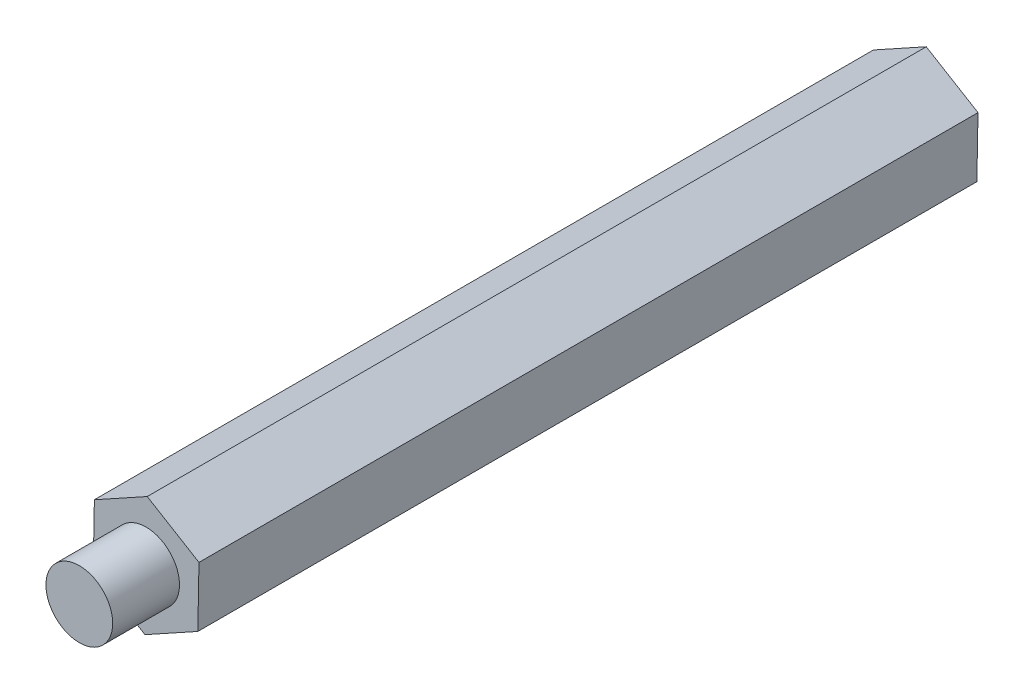
ISO-10303-21;
HEADER;
FILE_DESCRIPTION(('STEP AP214'),'2;1');
FILE_NAME('part.step','',(''),(''),'','','');
FILE_SCHEMA(('AUTOMOTIVE_DESIGN { 1 0 10303 214 1 1 1 1 }'));
ENDSEC;
DATA;
#1=APPLICATION_CONTEXT('core data for automotive mechanical design processes');
#2=APPLICATION_PROTOCOL_DEFINITION('international standard','automotive_design',2000,#1);
#3=PRODUCT_CONTEXT('',#1,'mechanical');
#4=PRODUCT('Part','Part','',(#3));
#5=PRODUCT_RELATED_PRODUCT_CATEGORY('part','',(#4));
#6=PRODUCT_DEFINITION_FORMATION('','',#4);
#7=PRODUCT_DEFINITION_CONTEXT('part definition',#1,'design');
#8=PRODUCT_DEFINITION('design','',#6,#7);
#9=PRODUCT_DEFINITION_SHAPE('','',#8);
#10=(LENGTH_UNIT() NAMED_UNIT(*) SI_UNIT(.MILLI.,.METRE.));
#11=(NAMED_UNIT(*) PLANE_ANGLE_UNIT() SI_UNIT($,.RADIAN.));
#12=(NAMED_UNIT(*) SI_UNIT($,.STERADIAN.) SOLID_ANGLE_UNIT());
#13=UNCERTAINTY_MEASURE_WITH_UNIT(LENGTH_MEASURE(1.E-05),#10,'distance_accuracy_value','');
#14=(GEOMETRIC_REPRESENTATION_CONTEXT(3) GLOBAL_UNCERTAINTY_ASSIGNED_CONTEXT((#13)) GLOBAL_UNIT_ASSIGNED_CONTEXT((#10,
#11,#12)) REPRESENTATION_CONTEXT('',''));
#15=CARTESIAN_POINT('',(0.,0.,0.));
#16=DIRECTION('',(0.,0.,1.));
#17=DIRECTION('',(1.,0.,0.));
#18=AXIS2_PLACEMENT_3D('',#15,#16,#17);
#19=CARTESIAN_POINT('',(0.0507511059576976,2.71307162798504,35.));
#20=DIRECTION('',(0.483715381528788,-0.875225359363209,0.));
#21=DIRECTION('',(0.875225359363209,0.483715381528788,0.));
#22=AXIS2_PLACEMENT_3D('',#19,#20,#21);
#23=PLANE('',#22);
#24=DIRECTION('',(-0.875225359363209,-0.483715381528788,0.));
#25=VECTOR('',#24,1.);
#26=CARTESIAN_POINT('',(0.0507511059576976,2.71307162798504,0.));
#27=LINE('',#26,#25);
#28=CARTESIAN_POINT('',(0.0507511059576976,2.71307162798504,0.));
#29=VERTEX_POINT('',#28);
#30=CARTESIAN_POINT('',(-2.324213399143,1.40048756102204,0.));
#31=VERTEX_POINT('',#30);
#32=EDGE_CURVE('E134',#29,#31,#27,.T.);
#33=ORIENTED_EDGE('',*,*,#32,.T.);
#34=DIRECTION('',(0.,0.,-1.));
#35=VECTOR('',#34,1.);
#36=CARTESIAN_POINT('',(-2.324213399143,1.40048756102204,35.));
#37=LINE('',#36,#35);
#38=CARTESIAN_POINT('',(-2.324213399143,1.40048756102204,35.));
#39=VERTEX_POINT('',#38);
#40=EDGE_CURVE('E46',#39,#31,#37,.T.);
#41=ORIENTED_EDGE('',*,*,#40,.F.);
#42=DIRECTION('',(-0.875225359363209,-0.483715381528788,0.));
#43=VECTOR('',#42,1.);
#44=CARTESIAN_POINT('',(0.0507511059576976,2.71307162798504,35.));
#45=LINE('',#44,#43);
#46=CARTESIAN_POINT('',(0.0507511059576976,2.71307162798504,35.));
#47=VERTEX_POINT('',#46);
#48=EDGE_CURVE('E151',#47,#39,#45,.T.);
#49=ORIENTED_EDGE('',*,*,#48,.F.);
#50=DIRECTION('',(0.,0.,-1.));
#51=VECTOR('',#50,1.);
#52=CARTESIAN_POINT('',(0.0507511059576976,2.71307162798504,35.));
#53=LINE('',#52,#51);
#54=EDGE_CURVE('E130',#47,#29,#53,.T.);
#55=ORIENTED_EDGE('',*,*,#54,.T.);
#56=EDGE_LOOP('',(#33,#41,#49,#55));
#57=FACE_BOUND('',#56,.T.);
#58=ADVANCED_FACE('F43',(#57),#23,.F.);
#59=CARTESIAN_POINT('',(-2.324213399143,1.40048756102204,35.));
#60=DIRECTION('',(0.999825086009298,-0.0187028710763916,0.));
#61=DIRECTION('',(0.0187028710763916,0.999825086009298,0.));
#62=AXIS2_PLACEMENT_3D('',#59,#60,#61);
#63=PLANE('',#62);
#64=DIRECTION('',(-0.0187028710763916,-0.999825086009298,0.));
#65=VECTOR('',#64,1.);
#66=CARTESIAN_POINT('',(-2.324213399143,1.40048756102204,0.));
#67=LINE('',#66,#65);
#68=CARTESIAN_POINT('',(-2.3749645051007,-1.312584066963,0.));
#69=VERTEX_POINT('',#68);
#70=EDGE_CURVE('E138',#31,#69,#67,.T.);
#71=ORIENTED_EDGE('',*,*,#70,.T.);
#72=DIRECTION('',(0.,0.,-1.));
#73=VECTOR('',#72,1.);
#74=CARTESIAN_POINT('',(-2.3749645051007,-1.312584066963,35.));
#75=LINE('',#74,#73);
#76=CARTESIAN_POINT('',(-2.3749645051007,-1.312584066963,35.));
#77=VERTEX_POINT('',#76);
#78=EDGE_CURVE('E157',#77,#69,#75,.T.);
#79=ORIENTED_EDGE('',*,*,#78,.F.);
#80=DIRECTION('',(-0.0187028710763916,-0.999825086009298,0.));
#81=VECTOR('',#80,1.);
#82=CARTESIAN_POINT('',(-2.324213399143,1.40048756102204,35.));
#83=LINE('',#82,#81);
#84=EDGE_CURVE('E99',#39,#77,#83,.T.);
#85=ORIENTED_EDGE('',*,*,#84,.F.);
#86=ORIENTED_EDGE('',*,*,#40,.T.);
#87=EDGE_LOOP('',(#71,#79,#85,#86));
#88=FACE_BOUND('',#87,.T.);
#89=ADVANCED_FACE('F164',(#88),#63,.F.);
#90=CARTESIAN_POINT('',(-2.3749645051007,-1.312584066963,35.));
#91=DIRECTION('',(0.51610970448051,0.856522488286817,0.));
#92=DIRECTION('',(-0.856522488286817,0.51610970448051,0.));
#93=AXIS2_PLACEMENT_3D('',#90,#91,#92);
#94=PLANE('',#93);
#95=DIRECTION('',(0.856522488286817,-0.51610970448051,0.));
#96=VECTOR('',#95,1.);
#97=CARTESIAN_POINT('',(-2.3749645051007,-1.312584066963,0.));
#98=LINE('',#97,#96);
#99=CARTESIAN_POINT('',(-0.0507511059576958,-2.71307162798504,0.));
#100=VERTEX_POINT('',#99);
#101=EDGE_CURVE('E142',#69,#100,#98,.T.);
#102=ORIENTED_EDGE('',*,*,#101,.T.);
#103=DIRECTION('',(0.,0.,-1.));
#104=VECTOR('',#103,1.);
#105=CARTESIAN_POINT('',(-0.0507511059576958,-2.71307162798504,35.));
#106=LINE('',#105,#104);
#107=CARTESIAN_POINT('',(-0.0507511059576958,-2.71307162798504,35.));
#108=VERTEX_POINT('',#107);
#109=EDGE_CURVE('E123',#108,#100,#106,.T.);
#110=ORIENTED_EDGE('',*,*,#109,.F.);
#111=DIRECTION('',(0.856522488286817,-0.51610970448051,0.));
#112=VECTOR('',#111,1.);
#113=CARTESIAN_POINT('',(-2.3749645051007,-1.312584066963,35.));
#114=LINE('',#113,#112);
#115=EDGE_CURVE('E112',#77,#108,#114,.T.);
#116=ORIENTED_EDGE('',*,*,#115,.F.);
#117=ORIENTED_EDGE('',*,*,#78,.T.);
#118=EDGE_LOOP('',(#102,#110,#116,#117));
#119=FACE_BOUND('',#118,.T.);
#120=ADVANCED_FACE('F170',(#119),#94,.F.);
#121=CARTESIAN_POINT('',(-0.0507511059576958,-2.71307162798504,35.));
#122=DIRECTION('',(-0.483715381528788,0.87522535936321,0.));
#123=DIRECTION('',(-0.87522535936321,-0.483715381528788,0.));
#124=AXIS2_PLACEMENT_3D('',#121,#122,#123);
#125=PLANE('',#124);
#126=DIRECTION('',(0.875225359363209,0.483715381528788,0.));
#127=VECTOR('',#126,1.);
#128=CARTESIAN_POINT('',(-0.0507511059576958,-2.71307162798504,0.));
#129=LINE('',#128,#127);
#130=CARTESIAN_POINT('',(2.324213399143,-1.40048756102204,0.));
#131=VERTEX_POINT('',#130);
#132=EDGE_CURVE('E121',#100,#131,#129,.T.);
#133=ORIENTED_EDGE('',*,*,#132,.T.);
#134=DIRECTION('',(0.,0.,-1.));
#135=VECTOR('',#134,1.);
#136=CARTESIAN_POINT('',(2.324213399143,-1.40048756102204,35.));
#137=LINE('',#136,#135);
#138=CARTESIAN_POINT('',(2.324213399143,-1.40048756102204,35.));
#139=VERTEX_POINT('',#138);
#140=EDGE_CURVE('E118',#139,#131,#137,.T.);
#141=ORIENTED_EDGE('',*,*,#140,.F.);
#142=DIRECTION('',(0.875225359363209,0.483715381528788,0.));
#143=VECTOR('',#142,1.);
#144=CARTESIAN_POINT('',(-0.0507511059576958,-2.71307162798504,35.));
#145=LINE('',#144,#143);
#146=EDGE_CURVE('E106',#108,#139,#145,.T.);
#147=ORIENTED_EDGE('',*,*,#146,.F.);
#148=ORIENTED_EDGE('',*,*,#109,.T.);
#149=EDGE_LOOP('',(#133,#141,#147,#148));
#150=FACE_BOUND('',#149,.T.);
#151=ADVANCED_FACE('F119',(#150),#125,.F.);
#152=CARTESIAN_POINT('',(2.324213399143,-1.40048756102204,35.));
#153=DIRECTION('',(-0.999825086009298,0.0187028710763917,0.));
#154=DIRECTION('',(-0.0187028710763917,-0.999825086009298,0.));
#155=AXIS2_PLACEMENT_3D('',#152,#153,#154);
#156=PLANE('',#155);
#157=DIRECTION('',(0.0187028710763917,0.999825086009298,0.));
#158=VECTOR('',#157,1.);
#159=CARTESIAN_POINT('',(2.324213399143,-1.40048756102204,0.));
#160=LINE('',#159,#158);
#161=CARTESIAN_POINT('',(2.3749645051007,1.312584066963,0.));
#162=VERTEX_POINT('',#161);
#163=EDGE_CURVE('E84',#131,#162,#160,.T.);
#164=ORIENTED_EDGE('',*,*,#163,.T.);
#165=DIRECTION('',(0.,0.,-1.));
#166=VECTOR('',#165,1.);
#167=CARTESIAN_POINT('',(2.3749645051007,1.312584066963,35.));
#168=LINE('',#167,#166);
#169=CARTESIAN_POINT('',(2.3749645051007,1.312584066963,35.));
#170=VERTEX_POINT('',#169);
#171=EDGE_CURVE('E124',#170,#162,#168,.T.);
#172=ORIENTED_EDGE('',*,*,#171,.F.);
#173=DIRECTION('',(0.0187028710763917,0.999825086009298,0.));
#174=VECTOR('',#173,1.);
#175=CARTESIAN_POINT('',(2.324213399143,-1.40048756102204,35.));
#176=LINE('',#175,#174);
#177=EDGE_CURVE('E110',#139,#170,#176,.T.);
#178=ORIENTED_EDGE('',*,*,#177,.F.);
#179=ORIENTED_EDGE('',*,*,#140,.T.);
#180=EDGE_LOOP('',(#164,#172,#178,#179));
#181=FACE_BOUND('',#180,.T.);
#182=ADVANCED_FACE('F126',(#181),#156,.F.);
#183=CARTESIAN_POINT('',(2.3749645051007,1.312584066963,35.));
#184=DIRECTION('',(-0.51610970448051,-0.856522488286817,0.));
#185=DIRECTION('',(0.856522488286817,-0.51610970448051,0.));
#186=AXIS2_PLACEMENT_3D('',#183,#184,#185);
#187=PLANE('',#186);
#188=DIRECTION('',(-0.856522488286817,0.51610970448051,0.));
#189=VECTOR('',#188,1.);
#190=CARTESIAN_POINT('',(2.3749645051007,1.312584066963,0.));
#191=LINE('',#190,#189);
#192=EDGE_CURVE('E90',#162,#29,#191,.T.);
#193=ORIENTED_EDGE('',*,*,#192,.T.);
#194=ORIENTED_EDGE('',*,*,#54,.F.);
#195=DIRECTION('',(-0.856522488286817,0.51610970448051,0.));
#196=VECTOR('',#195,1.);
#197=CARTESIAN_POINT('',(2.3749645051007,1.312584066963,35.));
#198=LINE('',#197,#196);
#199=EDGE_CURVE('E61',#170,#47,#198,.T.);
#200=ORIENTED_EDGE('',*,*,#199,.F.);
#201=ORIENTED_EDGE('',*,*,#171,.T.);
#202=EDGE_LOOP('',(#193,#194,#200,#201));
#203=FACE_BOUND('',#202,.T.);
#204=ADVANCED_FACE('F207',(#203),#187,.F.);
#205=CARTESIAN_POINT('',(0.,0.,35.));
#206=DIRECTION('',(0.,0.,1.));
#207=DIRECTION('',(1.,0.,0.));
#208=AXIS2_PLACEMENT_3D('',#205,#206,#207);
#209=PLANE('',#208);
#210=CARTESIAN_POINT('',(0.,0.,35.));
#211=DIRECTION('',(0.,0.,1.));
#212=DIRECTION('',(1.,0.,0.));
#213=AXIS2_PLACEMENT_3D('',#210,#211,#212);
#214=CIRCLE('',#213,1.5);
#215=CARTESIAN_POINT('',(1.5,0.,35.));
#216=VERTEX_POINT('',#215);
#217=EDGE_CURVE('E11',#216,#216,#214,.T.);
#218=ORIENTED_EDGE('',*,*,#217,.F.);
#219=EDGE_LOOP('',(#218));
#220=FACE_BOUND('',#219,.T.);
#221=ORIENTED_EDGE('',*,*,#48,.T.);
#222=ORIENTED_EDGE('',*,*,#84,.T.);
#223=ORIENTED_EDGE('',*,*,#115,.T.);
#224=ORIENTED_EDGE('',*,*,#146,.T.);
#225=ORIENTED_EDGE('',*,*,#177,.T.);
#226=ORIENTED_EDGE('',*,*,#199,.T.);
#227=EDGE_LOOP('',(#221,#222,#223,#224,#225,#226));
#228=FACE_BOUND('',#227,.T.);
#229=ADVANCED_FACE('F108',(#220,#228),#209,.T.);
#230=CARTESIAN_POINT('',(0.,0.,0.));
#231=DIRECTION('',(0.,0.,1.));
#232=DIRECTION('',(1.,0.,0.));
#233=AXIS2_PLACEMENT_3D('',#230,#231,#232);
#234=PLANE('',#233);
#235=CARTESIAN_POINT('',(0.,0.,0.));
#236=DIRECTION('',(0.,0.,-1.));
#237=DIRECTION('',(-1.,0.,0.));
#238=AXIS2_PLACEMENT_3D('',#235,#236,#237);
#239=CIRCLE('',#238,1.5);
#240=CARTESIAN_POINT('',(-1.5,0.,0.));
#241=VERTEX_POINT('',#240);
#242=EDGE_CURVE('E181',#241,#241,#239,.T.);
#243=ORIENTED_EDGE('',*,*,#242,.F.);
#244=EDGE_LOOP('',(#243));
#245=FACE_BOUND('',#244,.T.);
#246=ORIENTED_EDGE('',*,*,#32,.F.);
#247=ORIENTED_EDGE('',*,*,#192,.F.);
#248=ORIENTED_EDGE('',*,*,#163,.F.);
#249=ORIENTED_EDGE('',*,*,#132,.F.);
#250=ORIENTED_EDGE('',*,*,#101,.F.);
#251=ORIENTED_EDGE('',*,*,#70,.F.);
#252=EDGE_LOOP('',(#246,#247,#248,#249,#250,#251));
#253=FACE_BOUND('',#252,.T.);
#254=ADVANCED_FACE('F169',(#245,#253),#234,.F.);
#255=CARTESIAN_POINT('',(0.,0.,38.));
#256=DIRECTION('',(0.,0.,-1.));
#257=DIRECTION('',(-1.,0.,0.));
#258=AXIS2_PLACEMENT_3D('',#255,#256,#257);
#259=CYLINDRICAL_SURFACE('',#258,1.5);
#260=CARTESIAN_POINT('',(0.,0.,38.));
#261=DIRECTION('',(0.,0.,1.));
#262=DIRECTION('',(1.,0.,0.));
#263=AXIS2_PLACEMENT_3D('',#260,#261,#262);
#264=CIRCLE('',#263,1.5);
#265=CARTESIAN_POINT('',(1.5,0.,38.));
#266=VERTEX_POINT('',#265);
#267=EDGE_CURVE('E139',#266,#266,#264,.T.);
#268=ORIENTED_EDGE('',*,*,#267,.F.);
#269=EDGE_LOOP('',(#268));
#270=FACE_BOUND('',#269,.T.);
#271=ORIENTED_EDGE('',*,*,#217,.T.);
#272=EDGE_LOOP('',(#271));
#273=FACE_BOUND('',#272,.T.);
#274=ADVANCED_FACE('F199',(#270,#273),#259,.T.);
#275=CARTESIAN_POINT('',(0.,0.,38.));
#276=DIRECTION('',(0.,0.,1.));
#277=DIRECTION('',(1.,0.,0.));
#278=AXIS2_PLACEMENT_3D('',#275,#276,#277);
#279=PLANE('',#278);
#280=ORIENTED_EDGE('',*,*,#267,.T.);
#281=EDGE_LOOP('',(#280));
#282=FACE_BOUND('',#281,.T.);
#283=ADVANCED_FACE('F194',(#282),#279,.T.);
#284=CARTESIAN_POINT('',(0.,0.,3.));
#285=DIRECTION('',(0.,0.,-1.));
#286=DIRECTION('',(-1.,0.,0.));
#287=AXIS2_PLACEMENT_3D('',#284,#285,#286);
#288=CYLINDRICAL_SURFACE('',#287,1.5);
#289=CARTESIAN_POINT('',(0.,0.,3.));
#290=DIRECTION('',(0.,0.,-1.));
#291=DIRECTION('',(-1.,0.,0.));
#292=AXIS2_PLACEMENT_3D('',#289,#290,#291);
#293=CIRCLE('',#292,1.5);
#294=CARTESIAN_POINT('',(-1.5,0.,3.));
#295=VERTEX_POINT('',#294);
#296=EDGE_CURVE('E180',#295,#295,#293,.T.);
#297=ORIENTED_EDGE('',*,*,#296,.F.);
#298=EDGE_LOOP('',(#297));
#299=FACE_BOUND('',#298,.T.);
#300=ORIENTED_EDGE('',*,*,#242,.T.);
#301=EDGE_LOOP('',(#300));
#302=FACE_BOUND('',#301,.T.);
#303=ADVANCED_FACE('F191',(#299,#302),#288,.F.);
#304=CARTESIAN_POINT('',(0.,0.,3.));
#305=DIRECTION('',(0.,0.,-1.));
#306=DIRECTION('',(-1.,0.,0.));
#307=AXIS2_PLACEMENT_3D('',#304,#305,#306);
#308=PLANE('',#307);
#309=ORIENTED_EDGE('',*,*,#296,.T.);
#310=EDGE_LOOP('',(#309));
#311=FACE_BOUND('',#310,.T.);
#312=ADVANCED_FACE('F189',(#311),#308,.T.);
#313=CLOSED_SHELL('',(#58,#89,#120,#151,#182,#204,#229,#254,#274,#283,#303,#312));
#314=MANIFOLD_SOLID_BREP('B2',#313);
#315=ADVANCED_BREP_SHAPE_REPRESENTATION('',(#18,#314),#14);
#316=SHAPE_DEFINITION_REPRESENTATION(#9,#315);
ENDSEC;
END-ISO-10303-21;
